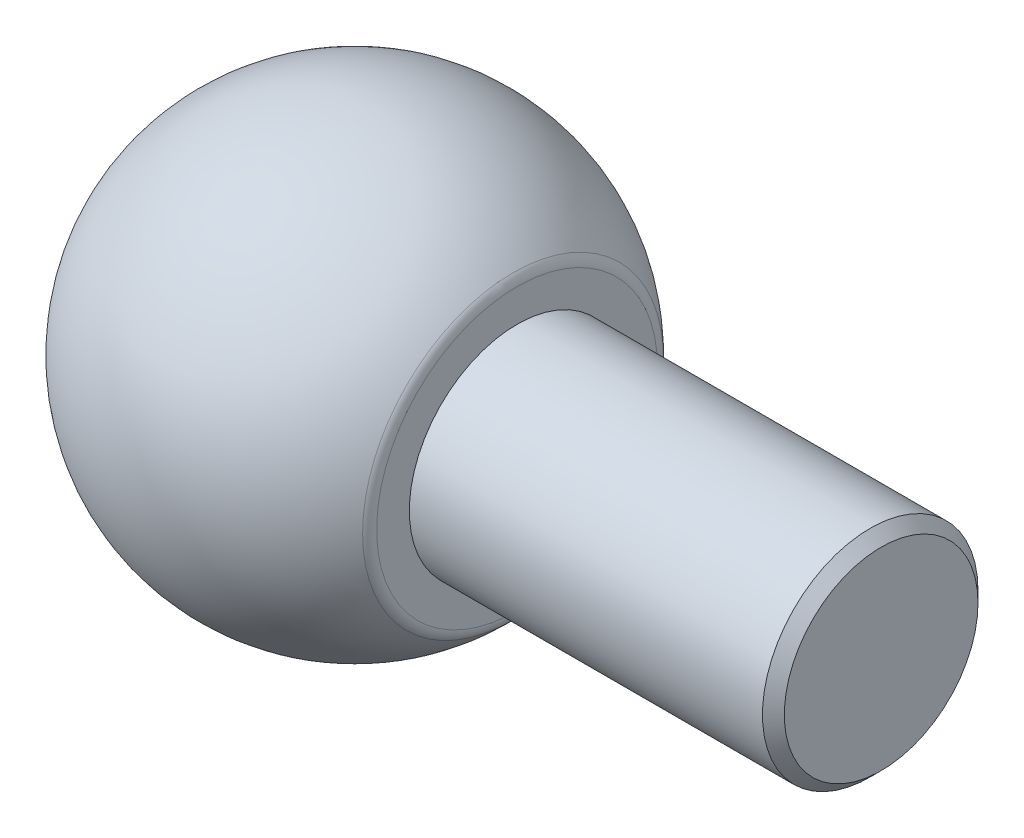
ISO-10303-21;
HEADER;
FILE_DESCRIPTION(('STEP AP214'),'2;1');
FILE_NAME('part.step','',(''),(''),'','','');
FILE_SCHEMA(('AUTOMOTIVE_DESIGN { 1 0 10303 214 1 1 1 1 }'));
ENDSEC;
DATA;
#1=APPLICATION_CONTEXT('core data for automotive mechanical design processes');
#2=APPLICATION_PROTOCOL_DEFINITION('international standard','automotive_design',2000,#1);
#3=PRODUCT_CONTEXT('',#1,'mechanical');
#4=PRODUCT('Part','Part','',(#3));
#5=PRODUCT_RELATED_PRODUCT_CATEGORY('part','',(#4));
#6=PRODUCT_DEFINITION_FORMATION('','',#4);
#7=PRODUCT_DEFINITION_CONTEXT('part definition',#1,'design');
#8=PRODUCT_DEFINITION('design','',#6,#7);
#9=PRODUCT_DEFINITION_SHAPE('','',#8);
#10=(LENGTH_UNIT() NAMED_UNIT(*) SI_UNIT(.MILLI.,.METRE.));
#11=(NAMED_UNIT(*) PLANE_ANGLE_UNIT() SI_UNIT($,.RADIAN.));
#12=(NAMED_UNIT(*) SI_UNIT($,.STERADIAN.) SOLID_ANGLE_UNIT());
#13=UNCERTAINTY_MEASURE_WITH_UNIT(LENGTH_MEASURE(1.E-05),#10,'distance_accuracy_value','');
#14=(GEOMETRIC_REPRESENTATION_CONTEXT(3) GLOBAL_UNCERTAINTY_ASSIGNED_CONTEXT((#13)) GLOBAL_UNIT_ASSIGNED_CONTEXT((#10,
#11,#12)) REPRESENTATION_CONTEXT('',''));
#15=CARTESIAN_POINT('',(0.,0.,0.));
#16=DIRECTION('',(0.,0.,1.));
#17=DIRECTION('',(1.,0.,0.));
#18=AXIS2_PLACEMENT_3D('',#15,#16,#17);
#19=CARTESIAN_POINT('',(0.,0.,0.));
#20=DIRECTION('',(0.,1.,0.));
#21=DIRECTION('',(1.,0.,0.));
#22=AXIS2_PLACEMENT_3D('',#19,#20,#21);
#23=SPHERICAL_SURFACE('',#22,3.);
#24=CARTESIAN_POINT('',(2.175,0.,0.));
#25=DIRECTION('',(-1.,0.,0.));
#26=DIRECTION('',(0.,0.,1.));
#27=AXIS2_PLACEMENT_3D('',#24,#25,#26);
#28=CIRCLE('',#27,2.06624659709339);
#29=CARTESIAN_POINT('',(2.175,0.,2.06624659709339));
#30=VERTEX_POINT('',#29);
#31=EDGE_CURVE('E73',#30,#30,#28,.T.);
#32=ORIENTED_EDGE('',*,*,#31,.T.);
#33=EDGE_LOOP('',(#32));
#34=FACE_BOUND('',#33,.T.);
#35=CARTESIAN_POINT('',(0.,-2.5377155080899,0.));
#36=DIRECTION('',(0.,1.,0.));
#37=DIRECTION('',(0.,0.,1.));
#38=AXIS2_PLACEMENT_3D('',#35,#36,#37);
#39=CIRCLE('',#38,1.6);
#40=CARTESIAN_POINT('',(0.,-2.5377155080899,1.6));
#41=VERTEX_POINT('',#40);
#42=EDGE_CURVE('E42',#41,#41,#39,.F.);
#43=ORIENTED_EDGE('',*,*,#42,.F.);
#44=EDGE_LOOP('',(#43));
#45=FACE_BOUND('',#44,.T.);
#46=ADVANCED_FACE('F38',(#34,#45),#23,.T.);
#47=CARTESIAN_POINT('',(2.23,0.,0.));
#48=DIRECTION('',(1.,0.,0.));
#49=DIRECTION('',(0.,0.,-1.));
#50=AXIS2_PLACEMENT_3D('',#47,#48,#49);
#51=PLANE('',#50);
#52=CARTESIAN_POINT('',(2.23,0.,0.));
#53=DIRECTION('',(1.,0.,0.));
#54=DIRECTION('',(0.,0.,-1.));
#55=AXIS2_PLACEMENT_3D('',#52,#53,#54);
#56=CIRCLE('',#55,1.92849682395383);
#57=CARTESIAN_POINT('',(2.23,0.,-1.92849682395383));
#58=VERTEX_POINT('',#57);
#59=EDGE_CURVE('E70',#58,#58,#56,.T.);
#60=ORIENTED_EDGE('',*,*,#59,.T.);
#61=EDGE_LOOP('',(#60));
#62=FACE_BOUND('',#61,.T.);
#63=CARTESIAN_POINT('',(2.23,0.,0.));
#64=DIRECTION('',(1.,0.,0.));
#65=DIRECTION('',(0.,0.,-1.));
#66=AXIS2_PLACEMENT_3D('',#63,#64,#65);
#67=CIRCLE('',#66,1.48);
#68=CARTESIAN_POINT('',(2.23,0.,-1.48));
#69=VERTEX_POINT('',#68);
#70=EDGE_CURVE('E67',#69,#69,#67,.T.);
#71=ORIENTED_EDGE('',*,*,#70,.F.);
#72=EDGE_LOOP('',(#71));
#73=FACE_BOUND('',#72,.T.);
#74=ADVANCED_FACE('F94',(#62,#73),#51,.T.);
#75=CARTESIAN_POINT('',(7.23,0.,0.));
#76=DIRECTION('',(-1.,0.,0.));
#77=DIRECTION('',(0.,0.,1.));
#78=AXIS2_PLACEMENT_3D('',#75,#76,#77);
#79=CYLINDRICAL_SURFACE('',#78,1.48);
#80=CARTESIAN_POINT('',(7.08,0.,0.));
#81=DIRECTION('',(1.,0.,0.));
#82=DIRECTION('',(0.,0.,-1.));
#83=AXIS2_PLACEMENT_3D('',#80,#81,#82);
#84=CIRCLE('',#83,1.48);
#85=CARTESIAN_POINT('',(7.08,0.,-1.48));
#86=VERTEX_POINT('',#85);
#87=EDGE_CURVE('E11',#86,#86,#84,.F.);
#88=ORIENTED_EDGE('',*,*,#87,.T.);
#89=EDGE_LOOP('',(#88));
#90=FACE_BOUND('',#89,.T.);
#91=ORIENTED_EDGE('',*,*,#70,.T.);
#92=EDGE_LOOP('',(#91));
#93=FACE_BOUND('',#92,.T.);
#94=ADVANCED_FACE('F100',(#90,#93),#79,.T.);
#95=CARTESIAN_POINT('',(7.23,0.,0.));
#96=DIRECTION('',(1.,0.,0.));
#97=DIRECTION('',(0.,0.,-1.));
#98=AXIS2_PLACEMENT_3D('',#95,#96,#97);
#99=PLANE('',#98);
#100=CARTESIAN_POINT('',(7.23,0.,0.));
#101=DIRECTION('',(1.,0.,0.));
#102=DIRECTION('',(0.,0.,-1.));
#103=AXIS2_PLACEMENT_3D('',#100,#101,#102);
#104=CIRCLE('',#103,1.33);
#105=CARTESIAN_POINT('',(7.23,0.,-1.33));
#106=VERTEX_POINT('',#105);
#107=EDGE_CURVE('E46',#106,#106,#104,.T.);
#108=ORIENTED_EDGE('',*,*,#107,.T.);
#109=EDGE_LOOP('',(#108));
#110=FACE_BOUND('',#109,.T.);
#111=ADVANCED_FACE('F79',(#110),#99,.T.);
#112=CARTESIAN_POINT('',(2.03,0.,0.));
#113=DIRECTION('',(1.,0.,0.));
#114=DIRECTION('',(0.,0.,-1.));
#115=AXIS2_PLACEMENT_3D('',#112,#113,#114);
#116=TOROIDAL_SURFACE('',#115,1.92849682395383,0.2);
#117=ORIENTED_EDGE('',*,*,#31,.F.);
#118=EDGE_LOOP('',(#117));
#119=FACE_BOUND('',#118,.T.);
#120=ORIENTED_EDGE('',*,*,#59,.F.);
#121=EDGE_LOOP('',(#120));
#122=FACE_BOUND('',#121,.T.);
#123=ADVANCED_FACE('F83',(#119,#122),#116,.T.);
#124=CARTESIAN_POINT('',(7.23,0.,0.));
#125=DIRECTION('',(-1.,0.,0.));
#126=DIRECTION('',(0.,0.,1.));
#127=AXIS2_PLACEMENT_3D('',#124,#125,#126);
#128=CONICAL_SURFACE('',#127,1.33,0.785398163397453);
#129=ORIENTED_EDGE('',*,*,#87,.F.);
#130=EDGE_LOOP('',(#129));
#131=FACE_BOUND('',#130,.T.);
#132=ORIENTED_EDGE('',*,*,#107,.F.);
#133=EDGE_LOOP('',(#132));
#134=FACE_BOUND('',#133,.T.);
#135=ADVANCED_FACE('F40',(#131,#134),#128,.T.);
#136=CARTESIAN_POINT('',(0.,-2.535,0.));
#137=DIRECTION('',(0.,-1.,0.));
#138=DIRECTION('',(0.,0.,-1.));
#139=AXIS2_PLACEMENT_3D('',#136,#137,#138);
#140=CYLINDRICAL_SURFACE('',#139,1.6);
#141=CARTESIAN_POINT('',(0.,-2.535,0.));
#142=DIRECTION('',(0.,1.,0.));
#143=DIRECTION('',(0.,0.,1.));
#144=AXIS2_PLACEMENT_3D('',#141,#142,#143);
#145=CIRCLE('',#144,1.6);
#146=CARTESIAN_POINT('',(0.,-2.535,1.6));
#147=VERTEX_POINT('',#146);
#148=EDGE_CURVE('E59',#147,#147,#145,.T.);
#149=ORIENTED_EDGE('',*,*,#148,.T.);
#150=EDGE_LOOP('',(#149));
#151=FACE_BOUND('',#150,.T.);
#152=ORIENTED_EDGE('',*,*,#42,.T.);
#153=EDGE_LOOP('',(#152));
#154=FACE_BOUND('',#153,.T.);
#155=ADVANCED_FACE('F82',(#151,#154),#140,.F.);
#156=CARTESIAN_POINT('',(0.,-2.535,0.));
#157=DIRECTION('',(0.,1.,0.));
#158=DIRECTION('',(0.,0.,1.));
#159=AXIS2_PLACEMENT_3D('',#156,#157,#158);
#160=PLANE('',#159);
#161=CARTESIAN_POINT('',(0.,-2.535,0.));
#162=DIRECTION('',(0.,-1.,0.));
#163=DIRECTION('',(0.,0.,-1.));
#164=AXIS2_PLACEMENT_3D('',#161,#162,#163);
#165=CIRCLE('',#164,1.24999999999999);
#166=CARTESIAN_POINT('',(0.,-2.535,-1.24999999999999));
#167=VERTEX_POINT('',#166);
#168=EDGE_CURVE('E60',#167,#167,#165,.T.);
#169=ORIENTED_EDGE('',*,*,#168,.F.);
#170=EDGE_LOOP('',(#169));
#171=FACE_BOUND('',#170,.T.);
#172=ORIENTED_EDGE('',*,*,#148,.F.);
#173=EDGE_LOOP('',(#172));
#174=FACE_BOUND('',#173,.T.);
#175=ADVANCED_FACE('F53',(#171,#174),#160,.F.);
#176=CARTESIAN_POINT('',(0.,1.465,0.));
#177=DIRECTION('',(0.,-1.,0.));
#178=DIRECTION('',(0.,0.,-1.));
#179=AXIS2_PLACEMENT_3D('',#176,#177,#178);
#180=CONICAL_SURFACE('',#179,1.25,1.02974425867665);
#181=CARTESIAN_POINT('',(0.,2.21607577378445,0.));
#182=VERTEX_POINT('',#181);
#183=VERTEX_LOOP('',#182);
#184=FACE_BOUND('',#183,.T.);
#185=CARTESIAN_POINT('',(0.,1.465,0.));
#186=DIRECTION('',(0.,-1.,0.));
#187=DIRECTION('',(0.,0.,-1.));
#188=AXIS2_PLACEMENT_3D('',#185,#186,#187);
#189=CIRCLE('',#188,1.25);
#190=CARTESIAN_POINT('',(0.,1.465,-1.25));
#191=VERTEX_POINT('',#190);
#192=EDGE_CURVE('E57',#191,#191,#189,.T.);
#193=ORIENTED_EDGE('',*,*,#192,.T.);
#194=EDGE_LOOP('',(#193));
#195=FACE_BOUND('',#194,.T.);
#196=ADVANCED_FACE('F49',(#184,#195),#180,.F.);
#197=CARTESIAN_POINT('',(0.,-2.535,0.));
#198=DIRECTION('',(0.,-1.,0.));
#199=DIRECTION('',(0.,0.,-1.));
#200=AXIS2_PLACEMENT_3D('',#197,#198,#199);
#201=CYLINDRICAL_SURFACE('',#200,1.24999999999999);
#202=ORIENTED_EDGE('',*,*,#192,.F.);
#203=EDGE_LOOP('',(#202));
#204=FACE_BOUND('',#203,.T.);
#205=ORIENTED_EDGE('',*,*,#168,.T.);
#206=EDGE_LOOP('',(#205));
#207=FACE_BOUND('',#206,.T.);
#208=ADVANCED_FACE('F52',(#204,#207),#201,.F.);
#209=CLOSED_SHELL('',(#46,#74,#94,#111,#123,#135,#155,#175,#196,#208));
#210=MANIFOLD_SOLID_BREP('B2',#209);
#211=ADVANCED_BREP_SHAPE_REPRESENTATION('',(#18,#210),#14);
#212=SHAPE_DEFINITION_REPRESENTATION(#9,#211);
ENDSEC;
END-ISO-10303-21;
